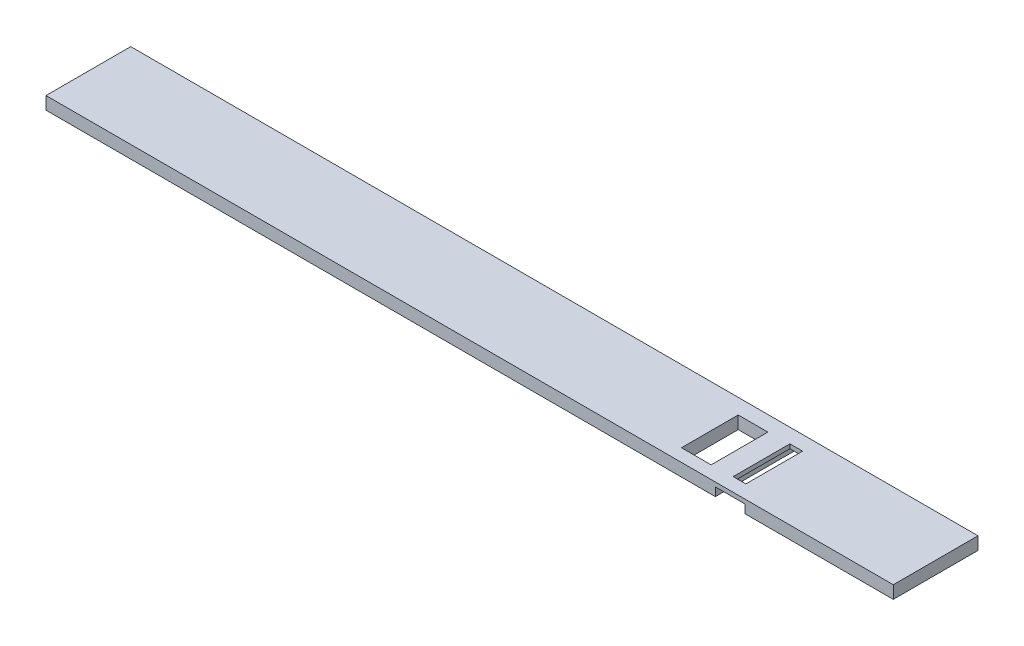
ISO-10303-21;
HEADER;
FILE_DESCRIPTION(('STEP AP214'),'2;1');
FILE_NAME('part.step','',(''),(''),'','','');
FILE_SCHEMA(('AUTOMOTIVE_DESIGN { 1 0 10303 214 1 1 1 1 }'));
ENDSEC;
DATA;
#1=APPLICATION_CONTEXT('core data for automotive mechanical design processes');
#2=APPLICATION_PROTOCOL_DEFINITION('international standard','automotive_design',2000,#1);
#3=PRODUCT_CONTEXT('',#1,'mechanical');
#4=PRODUCT('Part','Part','',(#3));
#5=PRODUCT_RELATED_PRODUCT_CATEGORY('part','',(#4));
#6=PRODUCT_DEFINITION_FORMATION('','',#4);
#7=PRODUCT_DEFINITION_CONTEXT('part definition',#1,'design');
#8=PRODUCT_DEFINITION('design','',#6,#7);
#9=PRODUCT_DEFINITION_SHAPE('','',#8);
#10=(LENGTH_UNIT() NAMED_UNIT(*) SI_UNIT(.MILLI.,.METRE.));
#11=(NAMED_UNIT(*) PLANE_ANGLE_UNIT() SI_UNIT($,.RADIAN.));
#12=(NAMED_UNIT(*) SI_UNIT($,.STERADIAN.) SOLID_ANGLE_UNIT());
#13=UNCERTAINTY_MEASURE_WITH_UNIT(LENGTH_MEASURE(1.E-05),#10,'distance_accuracy_value','');
#14=(GEOMETRIC_REPRESENTATION_CONTEXT(3) GLOBAL_UNCERTAINTY_ASSIGNED_CONTEXT((#13)) GLOBAL_UNIT_ASSIGNED_CONTEXT((#10,
#11,#12)) REPRESENTATION_CONTEXT('',''));
#15=CARTESIAN_POINT('',(0.,0.,0.));
#16=DIRECTION('',(0.,0.,1.));
#17=DIRECTION('',(1.,0.,0.));
#18=AXIS2_PLACEMENT_3D('',#15,#16,#17);
#19=CARTESIAN_POINT('',(0.,0.,0.));
#20=DIRECTION('',(0.,-1.,0.));
#21=DIRECTION('',(0.,0.,-1.));
#22=AXIS2_PLACEMENT_3D('',#19,#20,#21);
#23=PLANE('',#22);
#24=DIRECTION('',(0.,0.,1.));
#25=VECTOR('',#24,1.);
#26=CARTESIAN_POINT('',(790.,0.,-100.));
#27=LINE('',#26,#25);
#28=CARTESIAN_POINT('',(790.,0.,-100.));
#29=VERTEX_POINT('',#28);
#30=CARTESIAN_POINT('',(790.,0.,0.));
#31=VERTEX_POINT('',#30);
#32=EDGE_CURVE('E205',#29,#31,#27,.T.);
#33=ORIENTED_EDGE('',*,*,#32,.T.);
#34=DIRECTION('',(1.,0.,0.));
#35=VECTOR('',#34,1.);
#36=CARTESIAN_POINT('',(0.,0.,0.));
#37=LINE('',#36,#35);
#38=CARTESIAN_POINT('',(0.,0.,0.));
#39=VERTEX_POINT('',#38);
#40=EDGE_CURVE('E291',#39,#31,#37,.T.);
#41=ORIENTED_EDGE('',*,*,#40,.F.);
#42=DIRECTION('',(0.,0.,1.));
#43=VECTOR('',#42,1.);
#44=CARTESIAN_POINT('',(0.,0.,0.));
#45=LINE('',#44,#43);
#46=CARTESIAN_POINT('',(0.,0.,-100.));
#47=VERTEX_POINT('',#46);
#48=EDGE_CURVE('E262',#47,#39,#45,.T.);
#49=ORIENTED_EDGE('',*,*,#48,.F.);
#50=DIRECTION('',(-1.,0.,0.));
#51=VECTOR('',#50,1.);
#52=CARTESIAN_POINT('',(0.,0.,-100.));
#53=LINE('',#52,#51);
#54=EDGE_CURVE('E298',#29,#47,#53,.T.);
#55=ORIENTED_EDGE('',*,*,#54,.F.);
#56=EDGE_LOOP('',(#33,#41,#49,#55));
#57=FACE_BOUND('',#56,.T.);
#58=DIRECTION('',(0.,0.,1.));
#59=VECTOR('',#58,1.);
#60=CARTESIAN_POINT('',(735.,0.,-15.));
#61=LINE('',#60,#59);
#62=CARTESIAN_POINT('',(735.,0.,-82.));
#63=VERTEX_POINT('',#62);
#64=CARTESIAN_POINT('',(735.,0.,-15.));
#65=VERTEX_POINT('',#64);
#66=EDGE_CURVE('E228',#63,#65,#61,.T.);
#67=ORIENTED_EDGE('',*,*,#66,.T.);
#68=DIRECTION('',(1.,0.,0.));
#69=VECTOR('',#68,1.);
#70=CARTESIAN_POINT('',(735.,0.,-15.));
#71=LINE('',#70,#69);
#72=CARTESIAN_POINT('',(770.,0.,-15.));
#73=VERTEX_POINT('',#72);
#74=EDGE_CURVE('E232',#65,#73,#71,.T.);
#75=ORIENTED_EDGE('',*,*,#74,.T.);
#76=DIRECTION('',(0.,0.,-1.));
#77=VECTOR('',#76,1.);
#78=CARTESIAN_POINT('',(770.,0.,-15.));
#79=LINE('',#78,#77);
#80=CARTESIAN_POINT('',(770.,0.,-82.));
#81=VERTEX_POINT('',#80);
#82=EDGE_CURVE('E237',#73,#81,#79,.T.);
#83=ORIENTED_EDGE('',*,*,#82,.T.);
#84=DIRECTION('',(-1.,0.,0.));
#85=VECTOR('',#84,1.);
#86=CARTESIAN_POINT('',(735.,0.,-82.));
#87=LINE('',#86,#85);
#88=EDGE_CURVE('E241',#81,#63,#87,.T.);
#89=ORIENTED_EDGE('',*,*,#88,.T.);
#90=EDGE_LOOP('',(#67,#75,#83,#89));
#91=FACE_BOUND('',#90,.T.);
#92=ADVANCED_FACE('F41',(#57,#91),#23,.T.);
#93=CARTESIAN_POINT('',(0.,15.,0.));
#94=DIRECTION('',(1.,0.,0.));
#95=DIRECTION('',(0.,0.,-1.));
#96=AXIS2_PLACEMENT_3D('',#93,#94,#95);
#97=PLANE('',#96);
#98=ORIENTED_EDGE('',*,*,#48,.T.);
#99=DIRECTION('',(0.,-1.,0.));
#100=VECTOR('',#99,1.);
#101=CARTESIAN_POINT('',(0.,15.,0.));
#102=LINE('',#101,#100);
#103=CARTESIAN_POINT('',(0.,15.,0.));
#104=VERTEX_POINT('',#103);
#105=EDGE_CURVE('E313',#104,#39,#102,.T.);
#106=ORIENTED_EDGE('',*,*,#105,.F.);
#107=DIRECTION('',(0.,0.,1.));
#108=VECTOR('',#107,1.);
#109=CARTESIAN_POINT('',(0.,15.,0.));
#110=LINE('',#109,#108);
#111=CARTESIAN_POINT('',(0.,15.,-100.));
#112=VERTEX_POINT('',#111);
#113=EDGE_CURVE('E272',#112,#104,#110,.T.);
#114=ORIENTED_EDGE('',*,*,#113,.F.);
#115=DIRECTION('',(0.,-1.,0.));
#116=VECTOR('',#115,1.);
#117=CARTESIAN_POINT('',(0.,15.,-100.));
#118=LINE('',#117,#116);
#119=EDGE_CURVE('E286',#112,#47,#118,.T.);
#120=ORIENTED_EDGE('',*,*,#119,.T.);
#121=EDGE_LOOP('',(#98,#106,#114,#120));
#122=FACE_BOUND('',#121,.T.);
#123=ADVANCED_FACE('F43',(#122),#97,.F.);
#124=CARTESIAN_POINT('',(0.,15.,0.));
#125=DIRECTION('',(0.,0.,-1.));
#126=DIRECTION('',(-1.,0.,0.));
#127=AXIS2_PLACEMENT_3D('',#124,#125,#126);
#128=PLANE('',#127);
#129=ORIENTED_EDGE('',*,*,#40,.T.);
#130=DIRECTION('',(0.,-1.,0.));
#131=VECTOR('',#130,1.);
#132=CARTESIAN_POINT('',(790.,0.,0.));
#133=LINE('',#132,#131);
#134=CARTESIAN_POINT('',(790.,10.,0.));
#135=VERTEX_POINT('',#134);
#136=EDGE_CURVE('E187',#135,#31,#133,.T.);
#137=ORIENTED_EDGE('',*,*,#136,.F.);
#138=DIRECTION('',(-1.,0.,0.));
#139=VECTOR('',#138,1.);
#140=CARTESIAN_POINT('',(790.,10.,0.));
#141=LINE('',#140,#139);
#142=CARTESIAN_POINT('',(825.,10.,0.));
#143=VERTEX_POINT('',#142);
#144=EDGE_CURVE('E197',#143,#135,#141,.T.);
#145=ORIENTED_EDGE('',*,*,#144,.F.);
#146=DIRECTION('',(0.,1.,0.));
#147=VECTOR('',#146,1.);
#148=CARTESIAN_POINT('',(825.,0.,0.));
#149=LINE('',#148,#147);
#150=CARTESIAN_POINT('',(825.,0.,0.));
#151=VERTEX_POINT('',#150);
#152=EDGE_CURVE('E208',#151,#143,#149,.T.);
#153=ORIENTED_EDGE('',*,*,#152,.F.);
#154=CARTESIAN_POINT('',(1000.,0.,0.));
#155=VERTEX_POINT('',#154);
#156=EDGE_CURVE('E290',#151,#155,#37,.T.);
#157=ORIENTED_EDGE('',*,*,#156,.T.);
#158=DIRECTION('',(0.,-1.,0.));
#159=VECTOR('',#158,1.);
#160=CARTESIAN_POINT('',(1000.,15.,0.));
#161=LINE('',#160,#159);
#162=CARTESIAN_POINT('',(1000.,15.,0.));
#163=VERTEX_POINT('',#162);
#164=EDGE_CURVE('E309',#163,#155,#161,.T.);
#165=ORIENTED_EDGE('',*,*,#164,.F.);
#166=DIRECTION('',(1.,0.,0.));
#167=VECTOR('',#166,1.);
#168=CARTESIAN_POINT('',(0.,15.,0.));
#169=LINE('',#168,#167);
#170=EDGE_CURVE('E276',#104,#163,#169,.T.);
#171=ORIENTED_EDGE('',*,*,#170,.F.);
#172=ORIENTED_EDGE('',*,*,#105,.T.);
#173=EDGE_LOOP('',(#129,#137,#145,#153,#157,#165,#171,#172));
#174=FACE_BOUND('',#173,.T.);
#175=ADVANCED_FACE('F353',(#174),#128,.F.);
#176=CARTESIAN_POINT('',(1000.,15.,0.));
#177=DIRECTION('',(-1.,0.,0.));
#178=DIRECTION('',(0.,0.,1.));
#179=AXIS2_PLACEMENT_3D('',#176,#177,#178);
#180=PLANE('',#179);
#181=DIRECTION('',(0.,0.,-1.));
#182=VECTOR('',#181,1.);
#183=CARTESIAN_POINT('',(1000.,0.,0.));
#184=LINE('',#183,#182);
#185=CARTESIAN_POINT('',(1000.,0.,-100.));
#186=VERTEX_POINT('',#185);
#187=EDGE_CURVE('E295',#155,#186,#184,.T.);
#188=ORIENTED_EDGE('',*,*,#187,.T.);
#189=DIRECTION('',(0.,-1.,0.));
#190=VECTOR('',#189,1.);
#191=CARTESIAN_POINT('',(1000.,15.,-100.));
#192=LINE('',#191,#190);
#193=CARTESIAN_POINT('',(1000.,15.,-100.));
#194=VERTEX_POINT('',#193);
#195=EDGE_CURVE('E305',#194,#186,#192,.T.);
#196=ORIENTED_EDGE('',*,*,#195,.F.);
#197=DIRECTION('',(0.,0.,-1.));
#198=VECTOR('',#197,1.);
#199=CARTESIAN_POINT('',(1000.,15.,0.));
#200=LINE('',#199,#198);
#201=EDGE_CURVE('E280',#163,#194,#200,.T.);
#202=ORIENTED_EDGE('',*,*,#201,.F.);
#203=ORIENTED_EDGE('',*,*,#164,.T.);
#204=EDGE_LOOP('',(#188,#196,#202,#203));
#205=FACE_BOUND('',#204,.T.);
#206=ADVANCED_FACE('F382',(#205),#180,.F.);
#207=CARTESIAN_POINT('',(0.,15.,-100.));
#208=DIRECTION('',(0.,0.,1.));
#209=DIRECTION('',(1.,0.,0.));
#210=AXIS2_PLACEMENT_3D('',#207,#208,#209);
#211=PLANE('',#210);
#212=DIRECTION('',(-1.,0.,0.));
#213=VECTOR('',#212,1.);
#214=CARTESIAN_POINT('',(790.,10.,-100.));
#215=LINE('',#214,#213);
#216=CARTESIAN_POINT('',(825.,10.,-100.));
#217=VERTEX_POINT('',#216);
#218=CARTESIAN_POINT('',(790.,10.,-100.));
#219=VERTEX_POINT('',#218);
#220=EDGE_CURVE('E201',#217,#219,#215,.T.);
#221=ORIENTED_EDGE('',*,*,#220,.T.);
#222=DIRECTION('',(0.,-1.,0.));
#223=VECTOR('',#222,1.);
#224=CARTESIAN_POINT('',(790.,0.,-100.));
#225=LINE('',#224,#223);
#226=EDGE_CURVE('E192',#219,#29,#225,.T.);
#227=ORIENTED_EDGE('',*,*,#226,.T.);
#228=ORIENTED_EDGE('',*,*,#54,.T.);
#229=ORIENTED_EDGE('',*,*,#119,.F.);
#230=DIRECTION('',(-1.,0.,0.));
#231=VECTOR('',#230,1.);
#232=CARTESIAN_POINT('',(0.,15.,-100.));
#233=LINE('',#232,#231);
#234=EDGE_CURVE('E283',#194,#112,#233,.T.);
#235=ORIENTED_EDGE('',*,*,#234,.F.);
#236=ORIENTED_EDGE('',*,*,#195,.T.);
#237=CARTESIAN_POINT('',(825.,0.,-100.));
#238=VERTEX_POINT('',#237);
#239=EDGE_CURVE('E277',#186,#238,#53,.T.);
#240=ORIENTED_EDGE('',*,*,#239,.T.);
#241=DIRECTION('',(0.,1.,0.));
#242=VECTOR('',#241,1.);
#243=CARTESIAN_POINT('',(825.,0.,-100.));
#244=LINE('',#243,#242);
#245=EDGE_CURVE('E196',#238,#217,#244,.T.);
#246=ORIENTED_EDGE('',*,*,#245,.T.);
#247=EDGE_LOOP('',(#221,#227,#228,#229,#235,#236,#240,#246));
#248=FACE_BOUND('',#247,.T.);
#249=ADVANCED_FACE('F370',(#248),#211,.F.);
#250=CARTESIAN_POINT('',(0.,15.,0.));
#251=DIRECTION('',(0.,-1.,0.));
#252=DIRECTION('',(0.,0.,-1.));
#253=AXIS2_PLACEMENT_3D('',#250,#251,#252);
#254=PLANE('',#253);
#255=DIRECTION('',(1.,0.,0.));
#256=VECTOR('',#255,1.);
#257=CARTESIAN_POINT('',(795.,15.,-16.));
#258=LINE('',#257,#256);
#259=CARTESIAN_POINT('',(795.,15.,-16.));
#260=VERTEX_POINT('',#259);
#261=CARTESIAN_POINT('',(810.,15.,-16.));
#262=VERTEX_POINT('',#261);
#263=EDGE_CURVE('E168',#260,#262,#258,.T.);
#264=ORIENTED_EDGE('',*,*,#263,.F.);
#265=DIRECTION('',(0.,0.,1.));
#266=VECTOR('',#265,1.);
#267=CARTESIAN_POINT('',(795.,15.,-83.));
#268=LINE('',#267,#266);
#269=CARTESIAN_POINT('',(795.,15.,-83.));
#270=VERTEX_POINT('',#269);
#271=EDGE_CURVE('E57',#270,#260,#268,.T.);
#272=ORIENTED_EDGE('',*,*,#271,.F.);
#273=DIRECTION('',(-1.,0.,0.));
#274=VECTOR('',#273,1.);
#275=CARTESIAN_POINT('',(795.,15.,-83.));
#276=LINE('',#275,#274);
#277=CARTESIAN_POINT('',(810.,15.,-83.));
#278=VERTEX_POINT('',#277);
#279=EDGE_CURVE('E176',#278,#270,#276,.T.);
#280=ORIENTED_EDGE('',*,*,#279,.F.);
#281=DIRECTION('',(0.,0.,-1.));
#282=VECTOR('',#281,1.);
#283=CARTESIAN_POINT('',(810.,15.,-83.));
#284=LINE('',#283,#282);
#285=EDGE_CURVE('E158',#262,#278,#284,.T.);
#286=ORIENTED_EDGE('',*,*,#285,.F.);
#287=EDGE_LOOP('',(#264,#272,#280,#286));
#288=FACE_BOUND('',#287,.T.);
#289=DIRECTION('',(1.,0.,0.));
#290=VECTOR('',#289,1.);
#291=CARTESIAN_POINT('',(735.,15.,-15.));
#292=LINE('',#291,#290);
#293=CARTESIAN_POINT('',(735.,15.,-15.));
#294=VERTEX_POINT('',#293);
#295=CARTESIAN_POINT('',(770.,15.,-15.));
#296=VERTEX_POINT('',#295);
#297=EDGE_CURVE('E248',#294,#296,#292,.T.);
#298=ORIENTED_EDGE('',*,*,#297,.F.);
#299=DIRECTION('',(0.,0.,1.));
#300=VECTOR('',#299,1.);
#301=CARTESIAN_POINT('',(735.,15.,-15.));
#302=LINE('',#301,#300);
#303=CARTESIAN_POINT('',(735.,15.,-82.));
#304=VERTEX_POINT('',#303);
#305=EDGE_CURVE('E218',#304,#294,#302,.T.);
#306=ORIENTED_EDGE('',*,*,#305,.F.);
#307=DIRECTION('',(-1.,0.,0.));
#308=VECTOR('',#307,1.);
#309=CARTESIAN_POINT('',(735.,15.,-82.));
#310=LINE('',#309,#308);
#311=CARTESIAN_POINT('',(770.,15.,-82.));
#312=VERTEX_POINT('',#311);
#313=EDGE_CURVE('E233',#312,#304,#310,.T.);
#314=ORIENTED_EDGE('',*,*,#313,.F.);
#315=DIRECTION('',(0.,0.,-1.));
#316=VECTOR('',#315,1.);
#317=CARTESIAN_POINT('',(770.,15.,-15.));
#318=LINE('',#317,#316);
#319=EDGE_CURVE('E252',#296,#312,#318,.T.);
#320=ORIENTED_EDGE('',*,*,#319,.F.);
#321=EDGE_LOOP('',(#298,#306,#314,#320));
#322=FACE_BOUND('',#321,.T.);
#323=ORIENTED_EDGE('',*,*,#113,.T.);
#324=ORIENTED_EDGE('',*,*,#170,.T.);
#325=ORIENTED_EDGE('',*,*,#201,.T.);
#326=ORIENTED_EDGE('',*,*,#234,.T.);
#327=EDGE_LOOP('',(#323,#324,#325,#326));
#328=FACE_BOUND('',#327,.T.);
#329=ADVANCED_FACE('F173',(#288,#322,#328),#254,.F.);
#330=DIRECTION('',(0.,0.,1.));
#331=VECTOR('',#330,1.);
#332=CARTESIAN_POINT('',(825.,0.,-100.));
#333=LINE('',#332,#331);
#334=EDGE_CURVE('E222',#238,#151,#333,.T.);
#335=ORIENTED_EDGE('',*,*,#334,.F.);
#336=ORIENTED_EDGE('',*,*,#239,.F.);
#337=ORIENTED_EDGE('',*,*,#187,.F.);
#338=ORIENTED_EDGE('',*,*,#156,.F.);
#339=EDGE_LOOP('',(#335,#336,#337,#338));
#340=FACE_BOUND('',#339,.T.);
#341=ADVANCED_FACE('F347',(#340),#23,.T.);
#342=CARTESIAN_POINT('',(735.,0.,-15.));
#343=DIRECTION('',(-1.,0.,0.));
#344=DIRECTION('',(0.,0.,1.));
#345=AXIS2_PLACEMENT_3D('',#342,#343,#344);
#346=PLANE('',#345);
#347=ORIENTED_EDGE('',*,*,#305,.T.);
#348=DIRECTION('',(0.,1.,0.));
#349=VECTOR('',#348,1.);
#350=CARTESIAN_POINT('',(735.,0.,-15.));
#351=LINE('',#350,#349);
#352=EDGE_CURVE('E245',#65,#294,#351,.T.);
#353=ORIENTED_EDGE('',*,*,#352,.F.);
#354=ORIENTED_EDGE('',*,*,#66,.F.);
#355=DIRECTION('',(0.,1.,0.));
#356=VECTOR('',#355,1.);
#357=CARTESIAN_POINT('',(735.,0.,-82.));
#358=LINE('',#357,#356);
#359=EDGE_CURVE('E259',#63,#304,#358,.T.);
#360=ORIENTED_EDGE('',*,*,#359,.T.);
#361=EDGE_LOOP('',(#347,#353,#354,#360));
#362=FACE_BOUND('',#361,.T.);
#363=ADVANCED_FACE('F359',(#362),#346,.F.);
#364=CARTESIAN_POINT('',(735.,0.,-82.));
#365=DIRECTION('',(0.,0.,-1.));
#366=DIRECTION('',(-1.,0.,0.));
#367=AXIS2_PLACEMENT_3D('',#364,#365,#366);
#368=PLANE('',#367);
#369=ORIENTED_EDGE('',*,*,#313,.T.);
#370=ORIENTED_EDGE('',*,*,#359,.F.);
#371=ORIENTED_EDGE('',*,*,#88,.F.);
#372=DIRECTION('',(0.,1.,0.));
#373=VECTOR('',#372,1.);
#374=CARTESIAN_POINT('',(770.,0.,-82.));
#375=LINE('',#374,#373);
#376=EDGE_CURVE('E263',#81,#312,#375,.T.);
#377=ORIENTED_EDGE('',*,*,#376,.T.);
#378=EDGE_LOOP('',(#369,#370,#371,#377));
#379=FACE_BOUND('',#378,.T.);
#380=ADVANCED_FACE('F366',(#379),#368,.F.);
#381=CARTESIAN_POINT('',(770.,0.,-15.));
#382=DIRECTION('',(1.,0.,0.));
#383=DIRECTION('',(0.,0.,-1.));
#384=AXIS2_PLACEMENT_3D('',#381,#382,#383);
#385=PLANE('',#384);
#386=ORIENTED_EDGE('',*,*,#319,.T.);
#387=ORIENTED_EDGE('',*,*,#376,.F.);
#388=ORIENTED_EDGE('',*,*,#82,.F.);
#389=DIRECTION('',(0.,1.,0.));
#390=VECTOR('',#389,1.);
#391=CARTESIAN_POINT('',(770.,0.,-15.));
#392=LINE('',#391,#390);
#393=EDGE_CURVE('E266',#73,#296,#392,.T.);
#394=ORIENTED_EDGE('',*,*,#393,.T.);
#395=EDGE_LOOP('',(#386,#387,#388,#394));
#396=FACE_BOUND('',#395,.T.);
#397=ADVANCED_FACE('F447',(#396),#385,.F.);
#398=CARTESIAN_POINT('',(735.,0.,-15.));
#399=DIRECTION('',(0.,0.,1.));
#400=DIRECTION('',(1.,0.,0.));
#401=AXIS2_PLACEMENT_3D('',#398,#399,#400);
#402=PLANE('',#401);
#403=ORIENTED_EDGE('',*,*,#297,.T.);
#404=ORIENTED_EDGE('',*,*,#393,.F.);
#405=ORIENTED_EDGE('',*,*,#74,.F.);
#406=ORIENTED_EDGE('',*,*,#352,.T.);
#407=EDGE_LOOP('',(#403,#404,#405,#406));
#408=FACE_BOUND('',#407,.T.);
#409=ADVANCED_FACE('F442',(#408),#402,.F.);
#410=CARTESIAN_POINT('',(790.,0.,-100.));
#411=DIRECTION('',(-1.,0.,0.));
#412=DIRECTION('',(0.,0.,1.));
#413=AXIS2_PLACEMENT_3D('',#410,#411,#412);
#414=PLANE('',#413);
#415=ORIENTED_EDGE('',*,*,#136,.T.);
#416=ORIENTED_EDGE('',*,*,#32,.F.);
#417=ORIENTED_EDGE('',*,*,#226,.F.);
#418=DIRECTION('',(0.,0.,1.));
#419=VECTOR('',#418,1.);
#420=CARTESIAN_POINT('',(790.,10.,-100.));
#421=LINE('',#420,#419);
#422=EDGE_CURVE('E215',#219,#135,#421,.T.);
#423=ORIENTED_EDGE('',*,*,#422,.T.);
#424=EDGE_LOOP('',(#415,#416,#417,#423));
#425=FACE_BOUND('',#424,.T.);
#426=ADVANCED_FACE('F438',(#425),#414,.F.);
#427=CARTESIAN_POINT('',(790.,10.,-100.));
#428=DIRECTION('',(0.,1.,0.));
#429=DIRECTION('',(0.,0.,1.));
#430=AXIS2_PLACEMENT_3D('',#427,#428,#429);
#431=PLANE('',#430);
#432=DIRECTION('',(-1.,0.,0.));
#433=VECTOR('',#432,1.);
#434=CARTESIAN_POINT('',(790.,10.,-83.));
#435=LINE('',#434,#433);
#436=CARTESIAN_POINT('',(810.,9.99999999999999,-83.));
#437=VERTEX_POINT('',#436);
#438=CARTESIAN_POINT('',(795.,9.99999999999999,-83.));
#439=VERTEX_POINT('',#438);
#440=EDGE_CURVE('E50',#437,#439,#435,.T.);
#441=ORIENTED_EDGE('',*,*,#440,.T.);
#442=DIRECTION('',(0.,0.,1.));
#443=VECTOR('',#442,1.);
#444=CARTESIAN_POINT('',(795.,10.,-100.));
#445=LINE('',#444,#443);
#446=CARTESIAN_POINT('',(795.,9.99999999999999,-16.));
#447=VERTEX_POINT('',#446);
#448=EDGE_CURVE('E11',#439,#447,#445,.T.);
#449=ORIENTED_EDGE('',*,*,#448,.T.);
#450=DIRECTION('',(1.,0.,0.));
#451=VECTOR('',#450,1.);
#452=CARTESIAN_POINT('',(790.,10.,-16.));
#453=LINE('',#452,#451);
#454=CARTESIAN_POINT('',(810.,10.,-16.));
#455=VERTEX_POINT('',#454);
#456=EDGE_CURVE('E317',#447,#455,#453,.T.);
#457=ORIENTED_EDGE('',*,*,#456,.T.);
#458=DIRECTION('',(0.,0.,-1.));
#459=VECTOR('',#458,1.);
#460=CARTESIAN_POINT('',(810.,10.,-100.));
#461=LINE('',#460,#459);
#462=EDGE_CURVE('E161',#455,#437,#461,.T.);
#463=ORIENTED_EDGE('',*,*,#462,.T.);
#464=EDGE_LOOP('',(#441,#449,#457,#463));
#465=FACE_BOUND('',#464,.T.);
#466=ORIENTED_EDGE('',*,*,#144,.T.);
#467=ORIENTED_EDGE('',*,*,#422,.F.);
#468=ORIENTED_EDGE('',*,*,#220,.F.);
#469=DIRECTION('',(0.,0.,1.));
#470=VECTOR('',#469,1.);
#471=CARTESIAN_POINT('',(825.,10.,-100.));
#472=LINE('',#471,#470);
#473=EDGE_CURVE('E219',#217,#143,#472,.T.);
#474=ORIENTED_EDGE('',*,*,#473,.T.);
#475=EDGE_LOOP('',(#466,#467,#468,#474));
#476=FACE_BOUND('',#475,.T.);
#477=ADVANCED_FACE('F325',(#465,#476),#431,.F.);
#478=CARTESIAN_POINT('',(825.,0.,-100.));
#479=DIRECTION('',(1.,0.,0.));
#480=DIRECTION('',(0.,0.,-1.));
#481=AXIS2_PLACEMENT_3D('',#478,#479,#480);
#482=PLANE('',#481);
#483=ORIENTED_EDGE('',*,*,#152,.T.);
#484=ORIENTED_EDGE('',*,*,#473,.F.);
#485=ORIENTED_EDGE('',*,*,#245,.F.);
#486=ORIENTED_EDGE('',*,*,#334,.T.);
#487=EDGE_LOOP('',(#483,#484,#485,#486));
#488=FACE_BOUND('',#487,.T.);
#489=ADVANCED_FACE('F332',(#488),#482,.F.);
#490=CARTESIAN_POINT('',(795.,-85.,-83.));
#491=DIRECTION('',(-1.,0.,0.));
#492=DIRECTION('',(0.,0.,1.));
#493=AXIS2_PLACEMENT_3D('',#490,#491,#492);
#494=PLANE('',#493);
#495=DIRECTION('',(0.,1.,0.));
#496=VECTOR('',#495,1.);
#497=CARTESIAN_POINT('',(795.,-85.,-83.));
#498=LINE('',#497,#496);
#499=EDGE_CURVE('E184',#439,#270,#498,.T.);
#500=ORIENTED_EDGE('',*,*,#499,.T.);
#501=ORIENTED_EDGE('',*,*,#271,.T.);
#502=DIRECTION('',(0.,1.,0.));
#503=VECTOR('',#502,1.);
#504=CARTESIAN_POINT('',(795.,-85.,-16.));
#505=LINE('',#504,#503);
#506=EDGE_CURVE('E165',#447,#260,#505,.T.);
#507=ORIENTED_EDGE('',*,*,#506,.F.);
#508=ORIENTED_EDGE('',*,*,#448,.F.);
#509=EDGE_LOOP('',(#500,#501,#507,#508));
#510=FACE_BOUND('',#509,.T.);
#511=ADVANCED_FACE('F330',(#510),#494,.F.);
#512=CARTESIAN_POINT('',(795.,-85.,-83.));
#513=DIRECTION('',(0.,0.,-1.));
#514=DIRECTION('',(-1.,0.,0.));
#515=AXIS2_PLACEMENT_3D('',#512,#513,#514);
#516=PLANE('',#515);
#517=DIRECTION('',(0.,1.,0.));
#518=VECTOR('',#517,1.);
#519=CARTESIAN_POINT('',(810.,-85.,-83.));
#520=LINE('',#519,#518);
#521=EDGE_CURVE('E164',#437,#278,#520,.T.);
#522=ORIENTED_EDGE('',*,*,#521,.T.);
#523=ORIENTED_EDGE('',*,*,#279,.T.);
#524=ORIENTED_EDGE('',*,*,#499,.F.);
#525=ORIENTED_EDGE('',*,*,#440,.F.);
#526=EDGE_LOOP('',(#522,#523,#524,#525));
#527=FACE_BOUND('',#526,.T.);
#528=ADVANCED_FACE('F329',(#527),#516,.F.);
#529=CARTESIAN_POINT('',(810.,-85.,-83.));
#530=DIRECTION('',(1.,0.,0.));
#531=DIRECTION('',(0.,0.,-1.));
#532=AXIS2_PLACEMENT_3D('',#529,#530,#531);
#533=PLANE('',#532);
#534=DIRECTION('',(0.,1.,0.));
#535=VECTOR('',#534,1.);
#536=CARTESIAN_POINT('',(810.,-85.,-16.));
#537=LINE('',#536,#535);
#538=EDGE_CURVE('E65',#455,#262,#537,.T.);
#539=ORIENTED_EDGE('',*,*,#538,.T.);
#540=ORIENTED_EDGE('',*,*,#285,.T.);
#541=ORIENTED_EDGE('',*,*,#521,.F.);
#542=ORIENTED_EDGE('',*,*,#462,.F.);
#543=EDGE_LOOP('',(#539,#540,#541,#542));
#544=FACE_BOUND('',#543,.T.);
#545=ADVANCED_FACE('F155',(#544),#533,.F.);
#546=CARTESIAN_POINT('',(795.,-85.,-16.));
#547=DIRECTION('',(0.,0.,1.));
#548=DIRECTION('',(1.,0.,0.));
#549=AXIS2_PLACEMENT_3D('',#546,#547,#548);
#550=PLANE('',#549);
#551=ORIENTED_EDGE('',*,*,#506,.T.);
#552=ORIENTED_EDGE('',*,*,#263,.T.);
#553=ORIENTED_EDGE('',*,*,#538,.F.);
#554=ORIENTED_EDGE('',*,*,#456,.F.);
#555=EDGE_LOOP('',(#551,#552,#553,#554));
#556=FACE_BOUND('',#555,.T.);
#557=ADVANCED_FACE('F169',(#556),#550,.F.);
#558=CLOSED_SHELL('',(#92,#123,#175,#206,#249,#329,#341,#363,#380,#397,#409,#426,#477,#489,#511,
#528,#545,#557));
#559=MANIFOLD_SOLID_BREP('B2',#558);
#560=ADVANCED_BREP_SHAPE_REPRESENTATION('',(#18,#559),#14);
#561=SHAPE_DEFINITION_REPRESENTATION(#9,#560);
ENDSEC;
END-ISO-10303-21;
